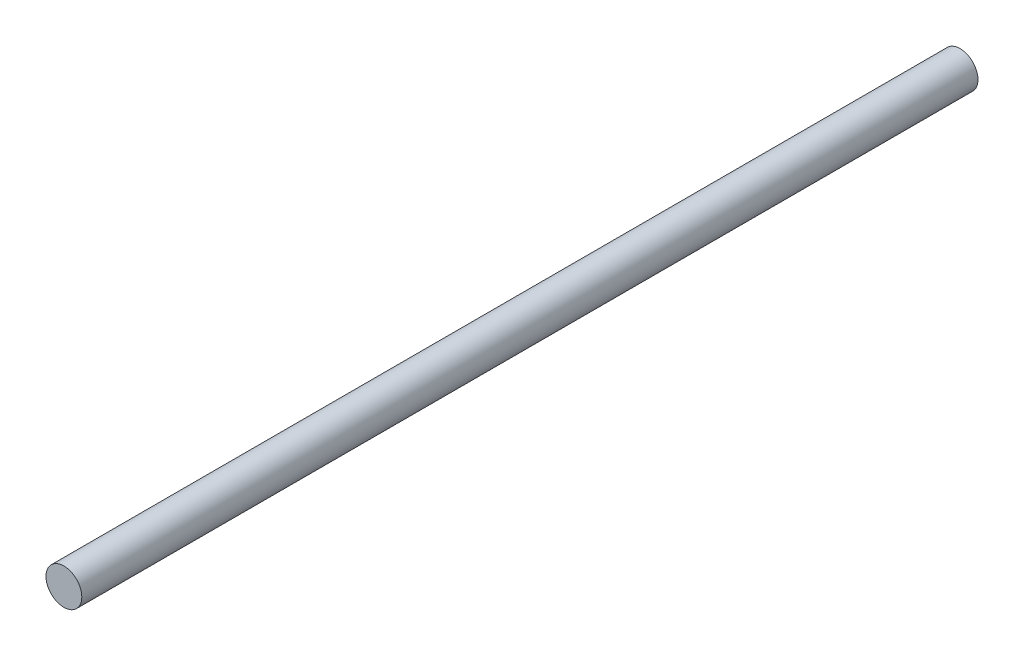
ISO-10303-21;
HEADER;
FILE_DESCRIPTION(('STEP AP214'),'2;1');
FILE_NAME('part.step','',(''),(''),'','','');
FILE_SCHEMA(('AUTOMOTIVE_DESIGN { 1 0 10303 214 1 1 1 1 }'));
ENDSEC;
DATA;
#1=APPLICATION_CONTEXT('core data for automotive mechanical design processes');
#2=APPLICATION_PROTOCOL_DEFINITION('international standard','automotive_design',2000,#1);
#3=PRODUCT_CONTEXT('',#1,'mechanical');
#4=PRODUCT('Part','Part','',(#3));
#5=PRODUCT_RELATED_PRODUCT_CATEGORY('part','',(#4));
#6=PRODUCT_DEFINITION_FORMATION('','',#4);
#7=PRODUCT_DEFINITION_CONTEXT('part definition',#1,'design');
#8=PRODUCT_DEFINITION('design','',#6,#7);
#9=PRODUCT_DEFINITION_SHAPE('','',#8);
#10=(LENGTH_UNIT() NAMED_UNIT(*) SI_UNIT(.MILLI.,.METRE.));
#11=(NAMED_UNIT(*) PLANE_ANGLE_UNIT() SI_UNIT($,.RADIAN.));
#12=(NAMED_UNIT(*) SI_UNIT($,.STERADIAN.) SOLID_ANGLE_UNIT());
#13=UNCERTAINTY_MEASURE_WITH_UNIT(LENGTH_MEASURE(1.E-05),#10,'distance_accuracy_value','');
#14=(GEOMETRIC_REPRESENTATION_CONTEXT(3) GLOBAL_UNCERTAINTY_ASSIGNED_CONTEXT((#13)) GLOBAL_UNIT_ASSIGNED_CONTEXT((#10,
#11,#12)) REPRESENTATION_CONTEXT('',''));
#15=CARTESIAN_POINT('',(0.,0.,0.));
#16=DIRECTION('',(0.,0.,1.));
#17=DIRECTION('',(1.,0.,0.));
#18=AXIS2_PLACEMENT_3D('',#15,#16,#17);
#19=CARTESIAN_POINT('',(0.,0.,25.));
#20=DIRECTION('',(0.,0.,-1.));
#21=DIRECTION('',(-1.,0.,0.));
#22=AXIS2_PLACEMENT_3D('',#19,#20,#21);
#23=CYLINDRICAL_SURFACE('',#22,0.5);
#24=CARTESIAN_POINT('',(0.,0.,25.));
#25=DIRECTION('',(0.,0.,1.));
#26=DIRECTION('',(1.,0.,0.));
#27=AXIS2_PLACEMENT_3D('',#24,#25,#26);
#28=CIRCLE('',#27,0.5);
#29=CARTESIAN_POINT('',(0.5,0.,25.));
#30=VERTEX_POINT('',#29);
#31=EDGE_CURVE('E10',#30,#30,#28,.T.);
#32=ORIENTED_EDGE('',*,*,#31,.F.);
#33=EDGE_LOOP('',(#32));
#34=FACE_BOUND('',#33,.T.);
#35=CARTESIAN_POINT('',(0.,0.,0.));
#36=DIRECTION('',(0.,0.,1.));
#37=DIRECTION('',(1.,0.,0.));
#38=AXIS2_PLACEMENT_3D('',#35,#36,#37);
#39=CIRCLE('',#38,0.5);
#40=CARTESIAN_POINT('',(0.5,0.,0.));
#41=VERTEX_POINT('',#40);
#42=EDGE_CURVE('E35',#41,#41,#39,.T.);
#43=ORIENTED_EDGE('',*,*,#42,.T.);
#44=EDGE_LOOP('',(#43));
#45=FACE_BOUND('',#44,.T.);
#46=ADVANCED_FACE('F32',(#34,#45),#23,.T.);
#47=CARTESIAN_POINT('',(0.,0.,25.));
#48=DIRECTION('',(0.,0.,1.));
#49=DIRECTION('',(1.,0.,0.));
#50=AXIS2_PLACEMENT_3D('',#47,#48,#49);
#51=PLANE('',#50);
#52=ORIENTED_EDGE('',*,*,#31,.T.);
#53=EDGE_LOOP('',(#52));
#54=FACE_BOUND('',#53,.T.);
#55=ADVANCED_FACE('F47',(#54),#51,.T.);
#56=CARTESIAN_POINT('',(0.,0.,0.));
#57=DIRECTION('',(0.,0.,1.));
#58=DIRECTION('',(1.,0.,0.));
#59=AXIS2_PLACEMENT_3D('',#56,#57,#58);
#60=PLANE('',#59);
#61=ORIENTED_EDGE('',*,*,#42,.F.);
#62=EDGE_LOOP('',(#61));
#63=FACE_BOUND('',#62,.T.);
#64=ADVANCED_FACE('F45',(#63),#60,.F.);
#65=CLOSED_SHELL('',(#46,#55,#64));
#66=MANIFOLD_SOLID_BREP('B2',#65);
#67=ADVANCED_BREP_SHAPE_REPRESENTATION('',(#18,#66),#14);
#68=SHAPE_DEFINITION_REPRESENTATION(#9,#67);
ENDSEC;
END-ISO-10303-21;
